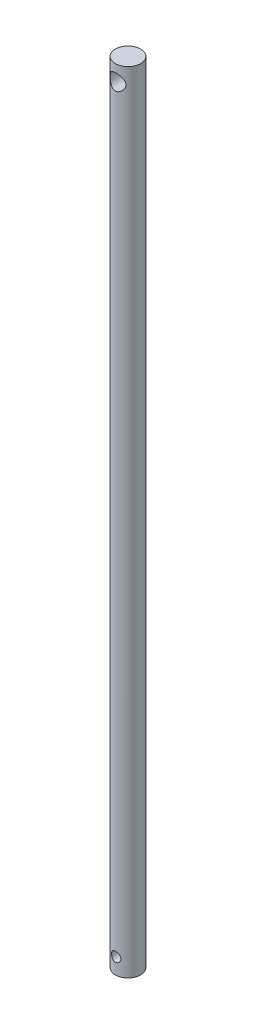
ISO-10303-21;
HEADER;
FILE_DESCRIPTION(('STEP AP214'),'2;1');
FILE_NAME('part.step','',(''),(''),'','','');
FILE_SCHEMA(('AUTOMOTIVE_DESIGN { 1 0 10303 214 1 1 1 1 }'));
ENDSEC;
DATA;
#1=APPLICATION_CONTEXT('core data for automotive mechanical design processes');
#2=APPLICATION_PROTOCOL_DEFINITION('international standard','automotive_design',2000,#1);
#3=PRODUCT_CONTEXT('',#1,'mechanical');
#4=PRODUCT('Part','Part','',(#3));
#5=PRODUCT_RELATED_PRODUCT_CATEGORY('part','',(#4));
#6=PRODUCT_DEFINITION_FORMATION('','',#4);
#7=PRODUCT_DEFINITION_CONTEXT('part definition',#1,'design');
#8=PRODUCT_DEFINITION('design','',#6,#7);
#9=PRODUCT_DEFINITION_SHAPE('','',#8);
#10=(LENGTH_UNIT() NAMED_UNIT(*) SI_UNIT(.MILLI.,.METRE.));
#11=(NAMED_UNIT(*) PLANE_ANGLE_UNIT() SI_UNIT($,.RADIAN.));
#12=(NAMED_UNIT(*) SI_UNIT($,.STERADIAN.) SOLID_ANGLE_UNIT());
#13=UNCERTAINTY_MEASURE_WITH_UNIT(LENGTH_MEASURE(1.E-05),#10,'distance_accuracy_value','');
#14=(GEOMETRIC_REPRESENTATION_CONTEXT(3) GLOBAL_UNCERTAINTY_ASSIGNED_CONTEXT((#13)) GLOBAL_UNIT_ASSIGNED_CONTEXT((#10,
#11,#12)) REPRESENTATION_CONTEXT('',''));
#15=CARTESIAN_POINT('',(0.,0.,0.));
#16=DIRECTION('',(0.,0.,1.));
#17=DIRECTION('',(1.,0.,0.));
#18=AXIS2_PLACEMENT_3D('',#15,#16,#17);
#19=CARTESIAN_POINT('',(0.,250.,0.));
#20=DIRECTION('',(0.,-1.,0.));
#21=DIRECTION('',(0.,0.,-1.));
#22=AXIS2_PLACEMENT_3D('',#19,#20,#21);
#23=CYLINDRICAL_SURFACE('',#22,4.);
#24=CARTESIAN_POINT('',(0.,6.50000000000001,-4.));
#25=CARTESIAN_POINT('',(-0.0812350589378527,6.50000290230312,-4.00000217456151));
#26=CARTESIAN_POINT('',(-0.162450241781792,6.49338023975162,-3.99750379283184));
#27=CARTESIAN_POINT('',(-0.322453452352361,6.46717180473007,-3.98778696006928));
#28=CARTESIAN_POINT('',(-0.401241827987616,6.44758789952943,-3.98056918893993));
#29=CARTESIAN_POINT('',(-0.554060784990879,6.39624699822824,-3.96218832391545));
#30=CARTESIAN_POINT('',(-0.628100224162278,6.36451348317821,-3.9510328434944));
#31=CARTESIAN_POINT('',(-0.769799310160254,6.28989358698418,-3.92588767765353));
#32=CARTESIAN_POINT('',(-0.83745723917788,6.24700421445584,-3.91189723227548));
#33=CARTESIAN_POINT('',(-0.967346417045826,6.14938746892909,-3.88186246971217));
#34=CARTESIAN_POINT('',(-1.02927073015119,6.0942697377406,-3.86576002583566));
#35=CARTESIAN_POINT('',(-1.14324421474363,5.97458956534116,-3.83360220871327));
#36=CARTESIAN_POINT('',(-1.19529036359203,5.91002424391213,-3.81754685135033));
#37=CARTESIAN_POINT('',(-1.28998202215985,5.77028253247679,-3.78662470617731));
#38=CARTESIAN_POINT('',(-1.3321939319576,5.69479563345418,-3.77182648820818));
#39=CARTESIAN_POINT('',(-1.40318646334084,5.53715164583148,-3.74599860237433));
#40=CARTESIAN_POINT('',(-1.43197244961239,5.4549972368449,-3.73496742975881));
#41=CARTESIAN_POINT('',(-1.47408431017549,5.2898832597418,-3.71854412824136));
#42=CARTESIAN_POINT('',(-1.48799593218558,5.20709496156456,-3.71293924350838));
#43=CARTESIAN_POINT('',(-1.50179556531648,5.04018384200616,-3.70738061461215));
#44=CARTESIAN_POINT('',(-1.50168936802631,4.95606158612553,-3.70742453659305));
#45=CARTESIAN_POINT('',(-1.48790429610018,4.79423047478704,-3.71297511632055));
#46=CARTESIAN_POINT('',(-1.47503808509003,4.71643909395582,-3.71815468871122));
#47=CARTESIAN_POINT('',(-1.4374416786833,4.56421284959468,-3.73284938059529));
#48=CARTESIAN_POINT('',(-1.41270969663258,4.48977849338612,-3.74236515298863));
#49=CARTESIAN_POINT('',(-1.35163748571904,4.34472293227177,-3.76485702190253));
#50=CARTESIAN_POINT('',(-1.31508648737101,4.2742005138787,-3.77789517988166));
#51=CARTESIAN_POINT('',(-1.23156073762698,4.14005426240903,-3.80594210139319));
#52=CARTESIAN_POINT('',(-1.18458238728897,4.0764328224803,-3.82095154457158));
#53=CARTESIAN_POINT('',(-1.07781780766549,3.95339633634912,-3.85248038859113));
#54=CARTESIAN_POINT('',(-1.01738298716955,3.89455135925191,-3.86903347455671));
#55=CARTESIAN_POINT('',(-0.88731259081902,3.7876620337942,-3.90091728164085));
#56=CARTESIAN_POINT('',(-0.817675603497363,3.73961934539433,-3.91624781465952));
#57=CARTESIAN_POINT('',(-0.669723436992419,3.65506960293748,-3.9442639480908));
#58=CARTESIAN_POINT('',(-0.591290713844719,3.61875241877894,-3.95690498259616));
#59=CARTESIAN_POINT('',(-0.428836850524582,3.56001739572996,-3.97778718326962));
#60=CARTESIAN_POINT('',(-0.344818210845767,3.53759338343888,-3.98603030341493));
#61=CARTESIAN_POINT('',(-0.178375243148665,3.50837721245806,-3.99684443228065));
#62=CARTESIAN_POINT('',(-0.0961036195622089,3.50081739361749,-3.99969369025686));
#63=CARTESIAN_POINT('',(0.0685724752550245,3.49930893610008,-4.00025893700126));
#64=CARTESIAN_POINT('',(0.150976912983373,3.50535727968322,-3.99797606386863));
#65=CARTESIAN_POINT('',(0.31026204856186,3.53031004230867,-3.98871709772643));
#66=CARTESIAN_POINT('',(0.387233328007336,3.54871154373709,-3.98192470962305));
#67=CARTESIAN_POINT('',(0.536941754957221,3.59718607254732,-3.96451477091717));
#68=CARTESIAN_POINT('',(0.609678350347535,3.62726061794804,-3.9538967228203));
#69=CARTESIAN_POINT('',(0.751247765110156,3.69918641243948,-3.92949624407681));
#70=CARTESIAN_POINT('',(0.819903083557795,3.74135772922339,-3.91563000209348));
#71=CARTESIAN_POINT('',(0.949392711726625,3.83591810317156,-3.88626671564664));
#72=CARTESIAN_POINT('',(1.01022412027045,3.88831093254515,-3.87076907009516));
#73=CARTESIAN_POINT('',(1.12603079874454,4.00540412212427,-3.8387332949099));
#74=CARTESIAN_POINT('',(1.18046154123569,4.0706421827727,-3.82218696503729));
#75=CARTESIAN_POINT('',(1.27771050031903,4.20965138470766,-3.79078815746854));
#76=CARTESIAN_POINT('',(1.32052767414518,4.2834232913885,-3.77593583194399));
#77=CARTESIAN_POINT('',(1.39337773518998,4.43801598677231,-3.74966829822463));
#78=CARTESIAN_POINT('',(1.42335685446918,4.51886474591044,-3.73826760328493));
#79=CARTESIAN_POINT('',(1.46907883466889,4.68500976368782,-3.72054032891005));
#80=CARTESIAN_POINT('',(1.48483050305535,4.77030323619812,-3.71421061057491));
#81=CARTESIAN_POINT('',(1.50086347097839,4.93701615954111,-3.70775894792573));
#82=CARTESIAN_POINT('',(1.50207331495837,5.01833263171689,-3.70726444523341));
#83=CARTESIAN_POINT('',(1.49136715641593,5.17994531627616,-3.71158412745292));
#84=CARTESIAN_POINT('',(1.47945239850124,5.26024162467158,-3.71639780898899));
#85=CARTESIAN_POINT('',(1.44355815630242,5.41504722671655,-3.73048141585432));
#86=CARTESIAN_POINT('',(1.41995798316524,5.48965834624535,-3.73961085376663));
#87=CARTESIAN_POINT('',(1.3616969677992,5.63390550849442,-3.76121548297845));
#88=CARTESIAN_POINT('',(1.32703332944945,5.70354028807014,-3.77369151995215));
#89=CARTESIAN_POINT('',(1.24552075938154,5.83982678969763,-3.80139723903965));
#90=CARTESIAN_POINT('',(1.1981283280301,5.90613079679991,-3.81673698440964));
#91=CARTESIAN_POINT('',(1.09334485729906,6.03014156097121,-3.84806246757177));
#92=CARTESIAN_POINT('',(1.03595064012808,6.08784557478675,-3.86404840943145));
#93=CARTESIAN_POINT('',(0.909080396784622,6.19620195582184,-3.89590424609881));
#94=CARTESIAN_POINT('',(0.839118644212991,6.24630375343467,-3.91172104900645));
#95=CARTESIAN_POINT('',(0.69121322320082,6.33402265527656,-3.94054514457031));
#96=CARTESIAN_POINT('',(0.61326893409062,6.37163878773637,-3.95355221851559));
#97=CARTESIAN_POINT('',(0.447999082002311,6.43437682904833,-3.9757429260668));
#98=CARTESIAN_POINT('',(0.360413422234207,6.4588870646019,-3.98473657158356));
#99=CARTESIAN_POINT('',(0.181875733606381,6.49169295992068,-3.99686242179587));
#100=CARTESIAN_POINT('',(0.0909254163648584,6.49999675148733,-3.99999756603967));
#101=CARTESIAN_POINT('',(0.,6.50000000000001,-4.));
#102=B_SPLINE_CURVE_WITH_KNOTS('',3,(#24,#25,#26,#27,#28,#29,#30,#31,#32,#33,#34,#35,#36,#37,
#38,#39,#40,#41,#42,#43,#44,#45,#46,#47,#48,#49,#50,#51,#52,#53,#54,#55,#56,#57,#58,#59,#60,#61,
#62,#63,#64,#65,#66,#67,#68,#69,#70,#71,#72,#73,#74,#75,#76,#77,#78,#79,#80,#81,#82,#83,#84,#85,
#86,#87,#88,#89,#90,#91,#92,#93,#94,#95,#96,#97,#98,#99,#100,#101),.UNSPECIFIED.,.T.,.F.,(4,2,2,
2,2,2,2,2,2,2,2,2,2,2,2,2,2,2,2,2,2,2,2,2,2,2,2,2,2,2,2,2,2,2,2,2,2,2,4),(0.,0.24336980156056,
0.486704549530461,0.729571369213574,0.972503379609491,1.22473618582716,1.47704604925622,
1.73896674501659,2.00078269352134,2.25185874416902,2.50283106079707,2.73878345119971,
2.97477138060589,3.21522408387018,3.45575990744259,3.71246153335813,3.96920257905066,
4.22991375286075,4.49050899698846,4.73725019635925,4.98393668390521,5.2211443792384,
5.45838293254454,5.702592218596,5.94689180019868,6.20536519455658,6.46386178920141,
6.72343066727204,6.98283874956507,7.22558763480252,7.46831350211259,7.70363142426534,
7.93900886656507,8.18672471884271,8.43451941997062,8.69572329654039,8.95694749805102,
9.22948515032042,9.50188601796127),.UNSPECIFIED.);
#103=CARTESIAN_POINT('',(0.,6.50000000000001,-4.));
#104=VERTEX_POINT('',#103);
#105=EDGE_CURVE('E10',#104,#104,#102,.T.);
#106=ORIENTED_EDGE('',*,*,#105,.T.);
#107=EDGE_LOOP('',(#106));
#108=FACE_BOUND('',#107,.T.);
#109=CARTESIAN_POINT('',(1.5,5.,3.70809924354783));
#110=CARTESIAN_POINT('',(1.50000304106109,4.91899251627921,3.70809640633806));
#111=CARTESIAN_POINT('',(1.49341597549487,4.83800507749636,3.71078260240986));
#112=CARTESIAN_POINT('',(1.46736187895468,4.6784719170868,3.72116159304967));
#113=CARTESIAN_POINT('',(1.44789523373263,4.59992612240499,3.72885423767112));
#114=CARTESIAN_POINT('',(1.39689657610574,4.44762462838647,3.748254802809));
#115=CARTESIAN_POINT('',(1.36539347266348,4.37385794334892,3.7599530956926));
#116=CARTESIAN_POINT('',(1.29131856742698,4.23262810318116,3.78603134206598));
#117=CARTESIAN_POINT('',(1.24874344095039,4.16516684971748,3.80041210067323));
#118=CARTESIAN_POINT('',(1.15146661374162,4.03510968837718,3.83103574665713));
#119=CARTESIAN_POINT('',(1.09630381213306,3.97287147037061,3.84733341923603));
#120=CARTESIAN_POINT('',(0.976395839778925,3.85827718532851,3.87949750628547));
#121=CARTESIAN_POINT('',(0.911648630256679,3.80592322625814,3.89536382814785));
#122=CARTESIAN_POINT('',(0.771694655177599,3.71086048770439,3.92552873936553));
#123=CARTESIAN_POINT('',(0.696206947538027,3.66854052528414,3.93975561223505));
#124=CARTESIAN_POINT('',(0.538555771965246,3.59734882747509,3.96438007973848));
#125=CARTESIAN_POINT('',(0.456394630933535,3.56847242800802,3.97477900217006));
#126=CARTESIAN_POINT('',(0.291489341676831,3.52624210422538,3.9901869710344));
#127=CARTESIAN_POINT('',(0.208923197281595,3.51227237255954,3.99540915214774));
#128=CARTESIAN_POINT('',(0.0424643637947851,3.49827879905501,4.0006401410794));
#129=CARTESIAN_POINT('',(-0.041427885062834,3.49825042238129,4.00065064414902));
#130=CARTESIAN_POINT('',(-0.203743543064477,3.51178176146517,3.99559265903894));
#131=CARTESIAN_POINT('',(-0.282232178266901,3.52466929794881,3.99077541996683));
#132=CARTESIAN_POINT('',(-0.435839217984392,3.56253591522555,3.97693274932263));
#133=CARTESIAN_POINT('',(-0.510957383430299,3.58751585226204,3.96790701975577));
#134=CARTESIAN_POINT('',(-0.656989017303105,3.64917045167585,3.9463776916753));
#135=CARTESIAN_POINT('',(-0.72782539228731,3.68601000526841,3.93382539470077));
#136=CARTESIAN_POINT('',(-0.86248660795756,3.77019209692939,3.90651310225279));
#137=CARTESIAN_POINT('',(-0.926309176932324,3.8175380230176,3.8917523951284));
#138=CARTESIAN_POINT('',(-1.04909048680094,3.92462728628319,3.86052529655816));
#139=CARTESIAN_POINT('',(-1.10754614526348,3.98493391565043,3.84400963763883));
#140=CARTESIAN_POINT('',(-1.21370395569342,4.11459299332156,3.81182460645722));
#141=CARTESIAN_POINT('',(-1.261403406929,4.18394770658664,3.79615544748847));
#142=CARTESIAN_POINT('',(-1.34565611808152,4.33171946746282,3.76712703500335));
#143=CARTESIAN_POINT('',(-1.38193847851831,4.41030349368607,3.75382677150277));
#144=CARTESIAN_POINT('',(-1.44056464441501,4.57309622516757,3.73172438629002));
#145=CARTESIAN_POINT('',(-1.46291620605595,4.65730177159369,3.72291976205783));
#146=CARTESIAN_POINT('',(-1.49190191709668,4.82397596231596,3.71139597222848));
#147=CARTESIAN_POINT('',(-1.49933521158966,4.90628410553614,3.70836785241537));
#148=CARTESIAN_POINT('',(-1.50057885636272,5.07100935674174,3.70786539525016));
#149=CARTESIAN_POINT('',(-1.49439261093762,5.15342643235247,3.71038967003987));
#150=CARTESIAN_POINT('',(-1.46929733520157,5.31192992228768,3.72039381629735));
#151=CARTESIAN_POINT('',(-1.45100618334225,5.38813113576466,3.72763276216449));
#152=CARTESIAN_POINT('',(-1.40299774640637,5.53634794472019,3.74596487046362));
#153=CARTESIAN_POINT('',(-1.37327812034623,5.60836267916814,3.75705882250173));
#154=CARTESIAN_POINT('',(-1.30200292275278,5.74916443807621,3.7823624311608));
#155=CARTESIAN_POINT('',(-1.26004545177047,5.81772929213734,3.79667328892065));
#156=CARTESIAN_POINT('',(-1.16591317862479,5.94712898172604,3.82662814294291));
#157=CARTESIAN_POINT('',(-1.11373463696434,6.00796097462463,3.84227262594077));
#158=CARTESIAN_POINT('',(-0.996727340900937,6.1241683731951,3.87433046553184));
#159=CARTESIAN_POINT('',(-0.93130634149106,6.17895340876875,3.89072969357028));
#160=CARTESIAN_POINT('',(-0.791797471753149,6.27683836758944,3.92149874963302));
#161=CARTESIAN_POINT('',(-0.717709573322671,6.31993825294584,3.93586857107664));
#162=CARTESIAN_POINT('',(-0.563016329468475,6.39294605619961,3.96094985704552));
#163=CARTESIAN_POINT('',(-0.482434433064625,6.4228991237926,3.9716738133801));
#164=CARTESIAN_POINT('',(-0.316881887523253,6.46865641384992,3.98829436712571));
#165=CARTESIAN_POINT('',(-0.231913320723591,6.4844672854224,3.99419323299413));
#166=CARTESIAN_POINT('',(-0.0653355852738145,6.50077440275483,4.00028407317073));
#167=CARTESIAN_POINT('',(0.0161807680608462,6.50210948305899,4.00078860953764));
#168=CARTESIAN_POINT('',(0.178226786412425,6.49158484055461,3.99684889809223));
#169=CARTESIAN_POINT('',(0.258756569245258,6.47972670911414,3.9924052471313));
#170=CARTESIAN_POINT('',(0.414548248377127,6.44374114850638,3.97921089603771));
#171=CARTESIAN_POINT('',(0.489890731068836,6.41992009412164,3.97056791378017));
#172=CARTESIAN_POINT('',(0.635515473006391,6.36098998661564,3.9498778362099));
#173=CARTESIAN_POINT('',(0.705796771275544,6.32587879669525,3.93783009655664));
#174=CARTESIAN_POINT('',(0.842540176994414,6.24368605649519,3.91090618300074));
#175=CARTESIAN_POINT('',(0.90871754884685,6.19616335948585,3.89593240108828));
#176=CARTESIAN_POINT('',(1.03241734752336,6.09119216981239,3.86499507694844));
#177=CARTESIAN_POINT('',(1.0899366712559,6.03374013419213,3.84903118274027));
#178=CARTESIAN_POINT('',(1.19781214236196,5.90693586835494,3.81688129739175));
#179=CARTESIAN_POINT('',(1.24762999816025,5.83711559784569,3.8007280534916));
#180=CARTESIAN_POINT('',(1.33484709556843,5.68958413042667,3.77098325003638));
#181=CARTESIAN_POINT('',(1.37224504878157,5.61187211594652,3.75739195631216));
#182=CARTESIAN_POINT('',(1.4346588697426,5.44704431902459,3.73402269853266));
#183=CARTESIAN_POINT('',(1.45906002899523,5.35966563348822,3.7244380329086));
#184=CARTESIAN_POINT('',(1.49172356722079,5.18151472804421,3.71147994336315));
#185=CARTESIAN_POINT('',(1.49999659339571,5.09074478729001,3.70810242179736));
#186=CARTESIAN_POINT('',(1.5,5.,3.70809924354783));
#187=B_SPLINE_CURVE_WITH_KNOTS('',3,(#109,#110,#111,#112,#113,#114,#115,#116,#117,#118,#119,
#120,#121,#122,#123,#124,#125,#126,#127,#128,#129,#130,#131,#132,#133,#134,#135,#136,#137,#138,
#139,#140,#141,#142,#143,#144,#145,#146,#147,#148,#149,#150,#151,#152,#153,#154,#155,#156,#157,
#158,#159,#160,#161,#162,#163,#164,#165,#166,#167,#168,#169,#170,#171,#172,#173,#174,#175,#176,
#177,#178,#179,#180,#181,#182,#183,#184,#185,#186),.UNSPECIFIED.,.T.,.F.,(4,2,2,2,2,2,2,2,2,2,2,
2,2,2,2,2,2,2,2,2,2,2,2,2,2,2,2,2,2,2,2,2,2,2,2,2,2,2,4),(0.,0.24268454141617,0.485361814598855,
0.72745985675703,0.969630679682933,1.22274652401128,1.47591628822983,1.73770072136421,
1.9993942638133,2.24980018489679,2.50012465404857,2.73806472803194,2.97602165263335,
3.21744131210668,3.45893893628976,3.71456675065875,3.97025867827335,4.23162592252967,
4.49284751635474,4.73965657740485,4.98640395388885,5.22143845928199,5.45652113429526,
5.70041561005822,5.94439948466356,6.20385016993624,6.46330169650178,6.72185508890169,
6.98028685560127,7.22365720549936,7.4669982031948,7.70440274003891,7.94185223512831,
8.18928323676987,8.43680270894965,8.69738599542079,8.95799630544243,9.23003178870926,
9.50188762323053),.UNSPECIFIED.);
#188=CARTESIAN_POINT('',(1.5,5.,3.70809924354783));
#189=VERTEX_POINT('',#188);
#190=EDGE_CURVE('E49',#189,#189,#187,.T.);
#191=ORIENTED_EDGE('',*,*,#190,.T.);
#192=EDGE_LOOP('',(#191));
#193=FACE_BOUND('',#192,.T.);
#194=CARTESIAN_POINT('',(0.,247.5,-4.));
#195=CARTESIAN_POINT('',(-0.127017476559871,247.499989523856,-3.99999041333571));
#196=CARTESIAN_POINT('',(-0.254191951791705,247.490253500098,-3.9938860659399));
#197=CARTESIAN_POINT('',(-0.504637456621345,247.451828870316,-3.97004375552586));
#198=CARTESIAN_POINT('',(-0.627900575825984,247.423104139739,-3.95228361873137));
#199=CARTESIAN_POINT('',(-0.866410868269165,247.348377146712,-3.90691695293563));
#200=CARTESIAN_POINT('',(-0.98169442070944,247.302460390212,-3.87935918690877));
#201=CARTESIAN_POINT('',(-1.20252080434996,247.195228332509,-3.81669199838277));
#202=CARTESIAN_POINT('',(-1.30806471304099,247.133914737447,-3.78158341266089));
#203=CARTESIAN_POINT('',(-1.51594836437078,246.992226843409,-3.70340304945466));
#204=CARTESIAN_POINT('',(-1.61735911616791,246.910721397298,-3.65991924217889));
#205=CARTESIAN_POINT('',(-1.80597275567284,246.733561653741,-3.57062700058922));
#206=CARTESIAN_POINT('',(-1.89315621594405,246.637888344261,-3.52481549782957));
#207=CARTESIAN_POINT('',(-2.06285746302522,246.419932210709,-3.42860837235626));
#208=CARTESIAN_POINT('',(-2.14314412018318,246.295800426569,-3.37843221966146));
#209=CARTESIAN_POINT('',(-2.28147932079995,246.032870369322,-3.28660396278105));
#210=CARTESIAN_POINT('',(-2.33956541787438,245.894097374832,-3.2449375200046));
#211=CARTESIAN_POINT('',(-2.41866801180576,245.642378952454,-3.18619151248814));
#212=CARTESIAN_POINT('',(-2.44539104794679,245.532066363082,-3.16553811970885));
#213=CARTESIAN_POINT('',(-2.48363687119141,245.307388148619,-3.13562714660859));
#214=CARTESIAN_POINT('',(-2.49518112485638,245.193028482827,-3.12635347378456));
#215=CARTESIAN_POINT('',(-2.50237836690497,244.963173967124,-3.12059771534501));
#216=CARTESIAN_POINT('',(-2.49798968200884,244.847676929422,-3.12414917427958));
#217=CARTESIAN_POINT('',(-2.47352633347828,244.619379791273,-3.14354804883412));
#218=CARTESIAN_POINT('',(-2.45343909745148,244.50658192715,-3.1594053196549));
#219=CARTESIAN_POINT('',(-2.39936209464259,244.289123103256,-3.20065145822147));
#220=CARTESIAN_POINT('',(-2.36570043522602,244.184335120283,-3.22581428653573));
#221=CARTESIAN_POINT('',(-2.28580369589504,243.981677603527,-3.2829113444342));
#222=CARTESIAN_POINT('',(-2.23956416894037,243.883810532157,-3.31484796808524));
#223=CARTESIAN_POINT('',(-2.12589830407257,243.67833359249,-3.38909625095661));
#224=CARTESIAN_POINT('',(-2.05612773657742,243.572318948148,-3.43223155208553));
#225=CARTESIAN_POINT('',(-1.90176111958631,243.372338873024,-3.52011451554718));
#226=CARTESIAN_POINT('',(-1.81714983251334,243.278385999955,-3.56486379714025));
#227=CARTESIAN_POINT('',(-1.61904732877727,243.089398990417,-3.659596674606));
#228=CARTESIAN_POINT('',(-1.50309447420009,242.996744057278,-3.70922571443731));
#229=CARTESIAN_POINT('',(-1.25426444468507,242.832288206369,-3.80056601840672));
#230=CARTESIAN_POINT('',(-1.12139395126998,242.76047909219,-3.84228039228675));
#231=CARTESIAN_POINT('',(-0.915775751567355,242.672654043365,-3.89435975869904));
#232=CARTESIAN_POINT('',(-0.848193583187303,242.64716571357,-3.9096687438527));
#233=CARTESIAN_POINT('',(-0.710492049478356,242.601992349521,-3.93701839875446));
#234=CARTESIAN_POINT('',(-0.640374175967814,242.582303963429,-3.94906095588035));
#235=CARTESIAN_POINT('',(-0.498239019538389,242.549065838358,-3.9694969952785));
#236=CARTESIAN_POINT('',(-0.426223500915191,242.535510596474,-3.97789374843885));
#237=CARTESIAN_POINT('',(-0.28096567356065,242.514753706686,-3.99078766491331));
#238=CARTESIAN_POINT('',(-0.207723576570672,242.507550973453,-3.99528549435854));
#239=CARTESIAN_POINT('',(-0.00911917689673026,242.496890695356,-4.00193773474167));
#240=CARTESIAN_POINT('',(0.116782016705772,242.499599636876,-4.000238122366));
#241=CARTESIAN_POINT('',(0.365967766011741,242.523759664465,-3.98518313408305));
#242=CARTESIAN_POINT('',(0.489252499360019,242.545209473925,-3.97182855210101));
#243=CARTESIAN_POINT('',(0.725036194002671,242.604478587983,-3.93547975555368));
#244=CARTESIAN_POINT('',(0.837768421062987,242.64162472077,-3.91288306371125));
#245=CARTESIAN_POINT('',(1.05527816125339,242.730592371312,-3.85991402897872));
#246=CARTESIAN_POINT('',(1.16005433861606,242.782416346501,-3.8295403841164));
#247=CARTESIAN_POINT('',(1.370167619692,242.905030537508,-3.75980014020655));
#248=CARTESIAN_POINT('',(1.47449380296912,242.977207172275,-3.7198352675537));
#249=CARTESIAN_POINT('',(1.6702854133008,243.135587696469,-3.63613942885724));
#250=CARTESIAN_POINT('',(1.76173634038031,243.221807168886,-3.59240430473131));
#251=CARTESIAN_POINT('',(1.94294835276259,243.420270089846,-3.49811738486726));
#252=CARTESIAN_POINT('',(2.03053702733643,243.534474415498,-3.44749766579188));
#253=CARTESIAN_POINT('',(2.18560704916444,243.777751566983,-3.35133525746889));
#254=CARTESIAN_POINT('',(2.25310231693772,243.906814012891,-3.30578906708366));
#255=CARTESIAN_POINT('',(2.35369543821022,244.1493842966,-3.23467060578837));
#256=CARTESIAN_POINT('',(2.39103791720688,244.260481501389,-3.20691272363802));
#257=CARTESIAN_POINT('',(2.4500021642075,244.488786291614,-3.1621006135125));
#258=CARTESIAN_POINT('',(2.47164849805253,244.60598401969,-3.14502966529819));
#259=CARTESIAN_POINT('',(2.49802767469227,244.84418055297,-3.124126499326));
#260=CARTESIAN_POINT('',(2.50266374586469,244.96519716788,-3.12037003193165));
#261=CARTESIAN_POINT('',(2.49439556773531,245.20626192383,-3.12698126375719));
#262=CARTESIAN_POINT('',(2.48148548821456,245.326309729619,-3.1373536577048));
#263=CARTESIAN_POINT('',(2.44076547086103,245.552059579436,-3.1691077700999));
#264=CARTESIAN_POINT('',(2.4142384719172,245.658138564502,-3.18953614189075));
#265=CARTESIAN_POINT('',(2.34835238743424,245.864270157518,-3.23835062785227));
#266=CARTESIAN_POINT('',(2.30898795090778,245.964320231817,-3.26674005971311));
#267=CARTESIAN_POINT('',(2.21205415803955,246.171193324338,-3.33327797617855));
#268=CARTESIAN_POINT('',(2.15267427981663,246.276899946264,-3.37224428524082));
#269=CARTESIAN_POINT('',(2.01999894889204,246.477877385709,-3.45335445323997));
#270=CARTESIAN_POINT('',(1.94669224594681,246.573139667374,-3.49550086439002));
#271=CARTESIAN_POINT('',(1.77134669685936,246.770025583798,-3.58803675426849));
#272=CARTESIAN_POINT('',(1.66649284489887,246.869169761539,-3.6384048826028));
#273=CARTESIAN_POINT('',(1.43961937990842,247.049001596125,-3.73398053838233));
#274=CARTESIAN_POINT('',(1.31758921196643,247.129677823678,-3.77918486147261));
#275=CARTESIAN_POINT('',(1.12346357942543,247.234563438559,-3.83959214728418));
#276=CARTESIAN_POINT('',(1.05679601158086,247.266874800047,-3.8585183415706));
#277=CARTESIAN_POINT('',(0.920199584373977,247.325672251824,-3.89335165397884));
#278=CARTESIAN_POINT('',(0.850272633931899,247.352161701135,-3.90926051225922));
#279=CARTESIAN_POINT('',(0.707873688437679,247.398857144462,-3.93753374175519));
#280=CARTESIAN_POINT('',(0.635409144572175,247.419080057246,-3.94990764965184));
#281=CARTESIAN_POINT('',(0.488456989557019,247.452975455582,-3.9707567745806));
#282=CARTESIAN_POINT('',(0.413970913545426,247.466652772439,-3.97923486692925));
#283=CARTESIAN_POINT('',(0.282852605093961,247.484590410227,-3.99038271291772));
#284=CARTESIAN_POINT('',(0.226501515914796,247.490361530252,-3.99398159517596));
#285=CARTESIAN_POINT('',(0.11344407451901,247.498068783627,-3.99879245372932));
#286=CARTESIAN_POINT('',(0.0567377005312872,247.50000467961,-4.00000428228699));
#287=CARTESIAN_POINT('',(0.,247.5,-4.));
#288=B_SPLINE_CURVE_WITH_KNOTS('',3,(#194,#195,#196,#197,#198,#199,#200,#201,#202,#203,#204,
#205,#206,#207,#208,#209,#210,#211,#212,#213,#214,#215,#216,#217,#218,#219,#220,#221,#222,#223,
#224,#225,#226,#227,#228,#229,#230,#231,#232,#233,#234,#235,#236,#237,#238,#239,#240,#241,#242,
#243,#244,#245,#246,#247,#248,#249,#250,#251,#252,#253,#254,#255,#256,#257,#258,#259,#260,#261,
#262,#263,#264,#265,#266,#267,#268,#269,#270,#271,#272,#273,#274,#275,#276,#277,#278,#279,#280,
#281,#282,#283,#284,#285,#286,#287),.UNSPECIFIED.,.T.,.F.,(4,2,2,2,2,2,2,2,2,2,2,2,2,2,2,2,2,2,
2,2,2,2,2,2,2,2,2,2,2,2,2,2,2,2,2,2,2,2,2,2,2,2,2,2,2,2,4),(0.,0.380824602868265,
0.762375788256928,1.14205397519029,1.52169010807759,1.93164374107244,2.34215256651405,
2.80825951705949,3.2735744921402,3.61824017759434,3.96241789414786,4.30749646997561,
4.65285169010173,4.9903167892088,5.32790135816073,5.7285490070873,6.12961045150374,
6.59684361399054,7.06389281455733,7.28510978359966,7.50619865744393,7.72708876613717,
7.94794112831302,8.32363778110186,8.69930884379602,9.06028425977638,9.42132014771975,
9.81879878896147,10.2167215457041,10.6724083464247,11.1277787130887,11.4876929754248,
11.8470427174175,12.2084336629144,12.5699447204277,12.9023575499052,13.2349091154193,
13.61560462989,13.9966089922258,14.4531049498527,14.9098826607204,15.1389848639482,
15.367954534847,15.5963005225024,15.8244777070606,15.994578512822,16.1646898459841),.UNSPECIFIED.);
#289=CARTESIAN_POINT('',(0.,247.5,-4.));
#290=VERTEX_POINT('',#289);
#291=EDGE_CURVE('E54',#290,#290,#288,.T.);
#292=ORIENTED_EDGE('',*,*,#291,.T.);
#293=EDGE_LOOP('',(#292));
#294=FACE_BOUND('',#293,.T.);
#295=CARTESIAN_POINT('',(2.5,245.,3.1224989991992));
#296=CARTESIAN_POINT('',(2.4999994109714,244.937843248554,3.12249991555421));
#297=CARTESIAN_POINT('',(2.49767581942174,244.875674053329,3.12436490733917));
#298=CARTESIAN_POINT('',(2.48843349840857,244.751882820452,3.13172923119025));
#299=CARTESIAN_POINT('',(2.48151206248434,244.690261126743,3.13723070381364));
#300=CARTESIAN_POINT('',(2.45397595058365,244.506773952256,3.15888953558504));
#301=CARTESIAN_POINT('',(2.4265899094646,244.386451668811,3.18020036271142));
#302=CARTESIAN_POINT('',(2.35576217141198,244.154401802122,3.23299770760367));
#303=CARTESIAN_POINT('',(2.31245961359202,244.042609584945,3.26439575383209));
#304=CARTESIAN_POINT('',(2.21143916430899,243.827991474666,3.33366000884439));
#305=CARTESIAN_POINT('',(2.15372087963018,243.725165826247,3.37152639405534));
#306=CARTESIAN_POINT('',(2.01647682425579,243.516266018696,3.45559225121875));
#307=CARTESIAN_POINT('',(1.9350642566695,243.411606674996,3.50222814511577));
#308=CARTESIAN_POINT('',(1.75662526657433,243.216238448376,3.59505503533367));
#309=CARTESIAN_POINT('',(1.65958538899783,243.125541720046,3.64124561158438));
#310=CARTESIAN_POINT('',(1.43833990582854,242.949779701827,3.73459524771314));
#311=CARTESIAN_POINT('',(1.31226934259653,242.86671381555,3.78119887781504));
#312=CARTESIAN_POINT('',(1.1116339554343,242.759454845264,3.84307251838774));
#313=CARTESIAN_POINT('',(1.04281240974105,242.726584861667,3.86236283092051));
#314=CARTESIAN_POINT('',(0.901758767615561,242.667045314637,3.89770436975436));
#315=CARTESIAN_POINT('',(0.829529068393811,242.640371468962,3.91375783207117));
#316=CARTESIAN_POINT('',(0.68970029791659,242.596016184744,3.94066759113823));
#317=CARTESIAN_POINT('',(0.622371981278599,242.577698023482,3.95188535984466));
#318=CARTESIAN_POINT('',(0.485997575898817,242.546697713687,3.97096241909162));
#319=CARTESIAN_POINT('',(0.416952503441694,242.534012310784,3.97882364879721));
#320=CARTESIAN_POINT('',(0.277765449857186,242.514486202365,3.99095470334737));
#321=CARTESIAN_POINT('',(0.207624174243916,242.507641883487,3.99522674847834));
#322=CARTESIAN_POINT('',(0.0669114466599485,242.499900786611,4.00006125072438));
#323=CARTESIAN_POINT('',(-0.00365995486026941,242.499003324037,4.00062413482248));
#324=CARTESIAN_POINT('',(-0.196045081555531,242.504725373547,3.99704479619503));
#325=CARTESIAN_POINT('',(-0.317681845488532,242.517306503079,3.98917040897436));
#326=CARTESIAN_POINT('',(-0.556636494620253,242.559730217966,3.96290903275931));
#327=CARTESIAN_POINT('',(-0.673954052677422,242.589574107974,3.94452124920477));
#328=CARTESIAN_POINT('',(-0.901771991763863,242.665208559283,3.89876170711609));
#329=CARTESIAN_POINT('',(-1.01225407159606,242.711039919571,3.87136697381047));
#330=CARTESIAN_POINT('',(-1.22404012071223,242.816937238984,3.80971291751354));
#331=CARTESIAN_POINT('',(-1.32534199174244,242.877006441064,3.77545203089318));
#332=CARTESIAN_POINT('',(-1.52942649744658,243.018056416924,3.69786441247167));
#333=CARTESIAN_POINT('',(-1.63082454612907,243.10070927669,3.65394006381521));
#334=CARTESIAN_POINT('',(-1.81919733573063,243.280264737207,3.56390927740507));
#335=CARTESIAN_POINT('',(-1.90615071842624,243.377188046384,3.51779973570409));
#336=CARTESIAN_POINT('',(-2.07470887167909,243.597411253173,3.42142883464466));
#337=CARTESIAN_POINT('',(-2.15413229677844,243.722502763358,3.37141162686596));
#338=CARTESIAN_POINT('',(-2.29052307550564,243.987292237301,3.28028278192382));
#339=CARTESIAN_POINT('',(-2.34753179448504,244.126962687453,3.23915480386931));
#340=CARTESIAN_POINT('',(-2.42437133527931,244.379538806106,3.18183753131763));
#341=CARTESIAN_POINT('',(-2.45003683445404,244.489821925213,3.16193408602513));
#342=CARTESIAN_POINT('',(-2.48620337073091,244.71423037756,3.13358277759547));
#343=CARTESIAN_POINT('',(-2.49672512520811,244.828350242657,3.12511926504439));
#344=CARTESIAN_POINT('',(-2.5019707209518,245.057457360502,3.12092267030677));
#345=CARTESIAN_POINT('',(-2.49665835896695,245.172446000478,3.12521876170185));
#346=CARTESIAN_POINT('',(-2.47051466367814,245.399561164318,3.14592085836188));
#347=CARTESIAN_POINT('',(-2.44967047849126,245.511685238371,3.16233689222906));
#348=CARTESIAN_POINT('',(-2.39409874195037,245.728436759426,3.20460120797144));
#349=CARTESIAN_POINT('',(-2.35960571424756,245.833157315894,3.23028954367818));
#350=CARTESIAN_POINT('',(-2.27804893702241,246.035574699894,3.2883114838875));
#351=CARTESIAN_POINT('',(-2.23098072583745,246.133269018878,3.32064744602082));
#352=CARTESIAN_POINT('',(-2.11530798730693,246.338611941663,3.39574401285203));
#353=CARTESIAN_POINT('',(-2.04430931160542,246.444614527302,3.43931724293016));
#354=CARTESIAN_POINT('',(-1.88737868921487,246.644370660654,3.52787943213339));
#355=CARTESIAN_POINT('',(-1.80143124902617,246.738111321242,3.57286982004468));
#356=CARTESIAN_POINT('',(-1.60076932492118,246.925964070641,3.66766209459505));
#357=CARTESIAN_POINT('',(-1.48365201617175,247.017727398485,3.71707933883202));
#358=CARTESIAN_POINT('',(-1.23256787407807,247.18014701472,3.80768973398607));
#359=CARTESIAN_POINT('',(-1.09860897940971,247.250813195127,3.8488867361901));
#360=CARTESIAN_POINT('',(-0.891930804655058,247.336581067975,3.89988966499777));
#361=CARTESIAN_POINT('',(-0.824318196039398,247.361297443951,3.91477055097246));
#362=CARTESIAN_POINT('',(-0.686640792876399,247.404938276732,3.94124643918619));
#363=CARTESIAN_POINT('',(-0.616577444051108,247.423866086151,3.95284334314805));
#364=CARTESIAN_POINT('',(-0.474639231464232,247.455605830139,3.9723851203995));
#365=CARTESIAN_POINT('',(-0.402766005755475,247.468423099516,3.98033317908836));
#366=CARTESIAN_POINT('',(-0.257881807142427,247.487739172293,3.99234168343343));
#367=CARTESIAN_POINT('',(-0.1848710244825,247.494239020931,3.99640277220024));
#368=CARTESIAN_POINT('',(0.013110277424928,247.503071515507,4.00191521492706));
#369=CARTESIAN_POINT('',(0.138539079205484,247.499265792909,3.99952706123947));
#370=CARTESIAN_POINT('',(0.386583137102163,247.473082410454,3.98321975018362));
#371=CARTESIAN_POINT('',(0.509198520626861,247.450705593321,3.96930111604857));
#372=CARTESIAN_POINT('',(0.744080605483878,247.389677584454,3.93192083384285));
#373=CARTESIAN_POINT('',(0.85655875263184,247.351617926435,3.90880701054802));
#374=CARTESIAN_POINT('',(1.0734303472192,247.260880537556,3.85489971248843));
#375=CARTESIAN_POINT('',(1.17782242685805,247.208200340433,3.82410494215308));
#376=CARTESIAN_POINT('',(1.387312977548,247.08367872128,3.75350673935648));
#377=CARTESIAN_POINT('',(1.49136012183782,247.010416009242,3.71310001864656));
#378=CARTESIAN_POINT('',(1.68643334934804,246.849846767486,3.62867283985205));
#379=CARTESIAN_POINT('',(1.77744451843683,246.762524391166,3.58464833191202));
#380=CARTESIAN_POINT('',(1.95744716561591,246.561767484938,3.49000828219718));
#381=CARTESIAN_POINT('',(2.04425661250065,246.446383387429,3.43935738427103));
#382=CARTESIAN_POINT('',(2.19754648509906,246.20071059024,3.34349647457111));
#383=CARTESIAN_POINT('',(2.26403815415029,246.070430188847,3.29828346204189));
#384=CARTESIAN_POINT('',(2.36198229412842,245.827194699215,3.2285953978009));
#385=CARTESIAN_POINT('',(2.3979245857683,245.716729427846,3.20174639338768));
#386=CARTESIAN_POINT('',(2.45425618419746,245.490060656998,3.15878358104509));
#387=CARTESIAN_POINT('',(2.47469472410168,245.3738765802,3.14263581150428));
#388=CARTESIAN_POINT('',(2.49119847139522,245.213940005354,3.12952857640607));
#389=CARTESIAN_POINT('',(2.4944943383796,245.171274474291,3.1268999430677));
#390=CARTESIAN_POINT('',(2.49889558125807,245.085741301048,3.12338461939862));
#391=CARTESIAN_POINT('',(2.50000040629188,245.042873610757,3.12249836712871));
#392=CARTESIAN_POINT('',(2.5,245.,3.1224989991992));
#393=B_SPLINE_CURVE_WITH_KNOTS('',3,(#295,#296,#297,#298,#299,#300,#301,#302,#303,#304,#305,
#306,#307,#308,#309,#310,#311,#312,#313,#314,#315,#316,#317,#318,#319,#320,#321,#322,#323,#324,
#325,#326,#327,#328,#329,#330,#331,#332,#333,#334,#335,#336,#337,#338,#339,#340,#341,#342,#343,
#344,#345,#346,#347,#348,#349,#350,#351,#352,#353,#354,#355,#356,#357,#358,#359,#360,#361,#362,
#363,#364,#365,#366,#367,#368,#369,#370,#371,#372,#373,#374,#375,#376,#377,#378,#379,#380,#381,
#382,#383,#384,#385,#386,#387,#388,#389,#390,#391,#392),.UNSPECIFIED.,.T.,.F.,(4,2,2,2,2,2,2,2,
2,2,2,2,2,2,2,2,2,2,2,2,2,2,2,2,2,2,2,2,2,2,2,2,2,2,2,2,2,2,2,2,2,2,2,2,2,2,2,2,4),(0.,
0.186415315858449,0.372940459994459,0.746478880764682,1.11682668423132,1.48718459072603,
1.90722798685068,2.32763499192878,2.7987602926597,3.03445880867313,3.26999394209508,
3.48170145743204,3.69328649746503,3.90474055342594,4.11617026725866,4.48184709708114,
4.84755156693919,5.21419620193004,5.58092442797433,5.99329080205308,6.40626158573465,
6.87316206383507,7.33919680735488,7.68265621505465,8.02564530559511,8.36941921026408,
8.71347788865093,9.05186495232131,9.39037223519204,9.79332737765191,10.1967026751544,
10.6647326786671,11.1325428866819,11.3527929661039,11.5729152387447,11.7928449800804,
12.0127383271002,12.3871595324234,12.7615637480926,13.1229788842094,13.4844550226786,
13.8834503840959,14.2828986410983,14.7399238503459,15.1966956936287,15.5530255473292,
15.9082190611887,16.0367696833385,16.1653526209168),.UNSPECIFIED.);
#394=CARTESIAN_POINT('',(2.5,245.,3.1224989991992));
#395=VERTEX_POINT('',#394);
#396=EDGE_CURVE('E59',#395,#395,#393,.T.);
#397=ORIENTED_EDGE('',*,*,#396,.T.);
#398=EDGE_LOOP('',(#397));
#399=FACE_BOUND('',#398,.T.);
#400=CARTESIAN_POINT('',(0.,250.,0.));
#401=DIRECTION('',(0.,1.,0.));
#402=DIRECTION('',(0.,0.,1.));
#403=AXIS2_PLACEMENT_3D('',#400,#401,#402);
#404=CIRCLE('',#403,4.);
#405=CARTESIAN_POINT('',(0.,250.,4.));
#406=VERTEX_POINT('',#405);
#407=EDGE_CURVE('E88',#406,#406,#404,.T.);
#408=ORIENTED_EDGE('',*,*,#407,.F.);
#409=EDGE_LOOP('',(#408));
#410=FACE_BOUND('',#409,.T.);
#411=CARTESIAN_POINT('',(0.,0.,0.));
#412=DIRECTION('',(0.,1.,0.));
#413=DIRECTION('',(0.,0.,1.));
#414=AXIS2_PLACEMENT_3D('',#411,#412,#413);
#415=CIRCLE('',#414,4.);
#416=CARTESIAN_POINT('',(0.,0.,4.));
#417=VERTEX_POINT('',#416);
#418=EDGE_CURVE('E89',#417,#417,#415,.T.);
#419=ORIENTED_EDGE('',*,*,#418,.T.);
#420=EDGE_LOOP('',(#419));
#421=FACE_BOUND('',#420,.T.);
#422=ADVANCED_FACE('F37',(#108,#193,#294,#399,#410,#421),#23,.T.);
#423=CARTESIAN_POINT('',(0.,250.,0.));
#424=DIRECTION('',(0.,1.,0.));
#425=DIRECTION('',(0.,0.,1.));
#426=AXIS2_PLACEMENT_3D('',#423,#424,#425);
#427=PLANE('',#426);
#428=ORIENTED_EDGE('',*,*,#407,.T.);
#429=EDGE_LOOP('',(#428));
#430=FACE_BOUND('',#429,.T.);
#431=ADVANCED_FACE('F80',(#430),#427,.T.);
#432=CARTESIAN_POINT('',(0.,0.,0.));
#433=DIRECTION('',(0.,1.,0.));
#434=DIRECTION('',(0.,0.,1.));
#435=AXIS2_PLACEMENT_3D('',#432,#433,#434);
#436=PLANE('',#435);
#437=ORIENTED_EDGE('',*,*,#418,.F.);
#438=EDGE_LOOP('',(#437));
#439=FACE_BOUND('',#438,.T.);
#440=ADVANCED_FACE('F78',(#439),#436,.F.);
#441=CARTESIAN_POINT('',(0.,245.,-4.));
#442=DIRECTION('',(0.,0.,1.));
#443=DIRECTION('',(1.,0.,0.));
#444=AXIS2_PLACEMENT_3D('',#441,#442,#443);
#445=CYLINDRICAL_SURFACE('',#444,2.5);
#446=ORIENTED_EDGE('',*,*,#396,.F.);
#447=EDGE_LOOP('',(#446));
#448=FACE_BOUND('',#447,.T.);
#449=ORIENTED_EDGE('',*,*,#291,.F.);
#450=EDGE_LOOP('',(#449));
#451=FACE_BOUND('',#450,.T.);
#452=ADVANCED_FACE('F72',(#448,#451),#445,.F.);
#453=CARTESIAN_POINT('',(0.,5.,-4.));
#454=DIRECTION('',(0.,0.,1.));
#455=DIRECTION('',(1.,0.,0.));
#456=AXIS2_PLACEMENT_3D('',#453,#454,#455);
#457=CYLINDRICAL_SURFACE('',#456,1.5);
#458=ORIENTED_EDGE('',*,*,#190,.F.);
#459=EDGE_LOOP('',(#458));
#460=FACE_BOUND('',#459,.T.);
#461=ORIENTED_EDGE('',*,*,#105,.F.);
#462=EDGE_LOOP('',(#461));
#463=FACE_BOUND('',#462,.T.);
#464=ADVANCED_FACE('F69',(#460,#463),#457,.F.);
#465=CLOSED_SHELL('',(#422,#431,#440,#452,#464));
#466=MANIFOLD_SOLID_BREP('B2',#465);
#467=ADVANCED_BREP_SHAPE_REPRESENTATION('',(#18,#466),#14);
#468=SHAPE_DEFINITION_REPRESENTATION(#9,#467);
ENDSEC;
END-ISO-10303-21;
